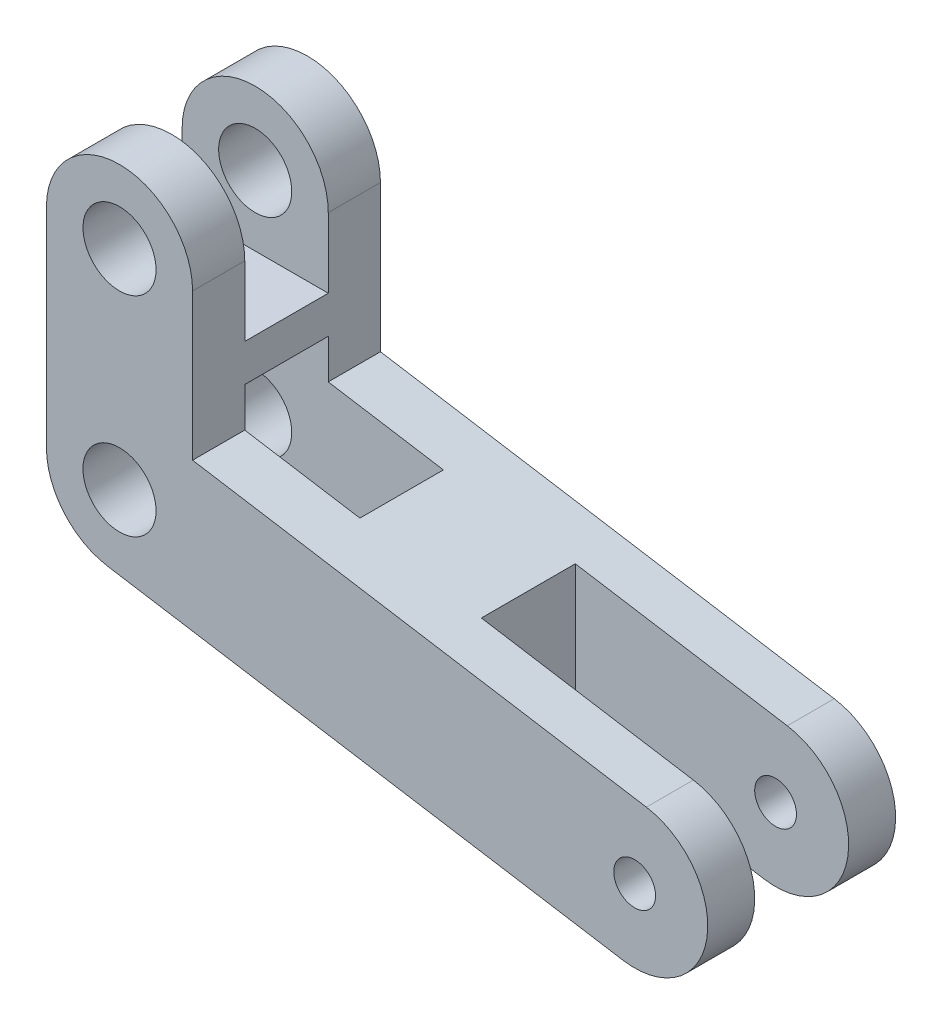
ISO-10303-21;
HEADER;
FILE_DESCRIPTION(('STEP AP214'),'2;1');
FILE_NAME('part.step','',(''),(''),'','','');
FILE_SCHEMA(('AUTOMOTIVE_DESIGN { 1 0 10303 214 1 1 1 1 }'));
ENDSEC;
DATA;
#1=APPLICATION_CONTEXT('core data for automotive mechanical design processes');
#2=APPLICATION_PROTOCOL_DEFINITION('international standard','automotive_design',2000,#1);
#3=PRODUCT_CONTEXT('',#1,'mechanical');
#4=PRODUCT('Part','Part','',(#3));
#5=PRODUCT_RELATED_PRODUCT_CATEGORY('part','',(#4));
#6=PRODUCT_DEFINITION_FORMATION('','',#4);
#7=PRODUCT_DEFINITION_CONTEXT('part definition',#1,'design');
#8=PRODUCT_DEFINITION('design','',#6,#7);
#9=PRODUCT_DEFINITION_SHAPE('','',#8);
#10=(LENGTH_UNIT() NAMED_UNIT(*) SI_UNIT(.MILLI.,.METRE.));
#11=(NAMED_UNIT(*) PLANE_ANGLE_UNIT() SI_UNIT($,.RADIAN.));
#12=(NAMED_UNIT(*) SI_UNIT($,.STERADIAN.) SOLID_ANGLE_UNIT());
#13=UNCERTAINTY_MEASURE_WITH_UNIT(LENGTH_MEASURE(1.E-05),#10,'distance_accuracy_value','');
#14=(GEOMETRIC_REPRESENTATION_CONTEXT(3) GLOBAL_UNCERTAINTY_ASSIGNED_CONTEXT((#13)) GLOBAL_UNIT_ASSIGNED_CONTEXT((#10,
#11,#12)) REPRESENTATION_CONTEXT('',''));
#15=CARTESIAN_POINT('',(0.,0.,0.));
#16=DIRECTION('',(0.,0.,1.));
#17=DIRECTION('',(1.,0.,0.));
#18=AXIS2_PLACEMENT_3D('',#15,#16,#17);
#19=CARTESIAN_POINT('',(24.6779253585061,-4.,4.5));
#20=DIRECTION('',(0.,0.,-1.));
#21=DIRECTION('',(-1.,0.,0.));
#22=AXIS2_PLACEMENT_3D('',#19,#20,#21);
#23=CYLINDRICAL_SURFACE('',#22,3.5);
#24=CARTESIAN_POINT('',(24.6779253585061,-4.,-2.25));
#25=DIRECTION('',(0.,0.,1.));
#26=DIRECTION('',(1.,0.,0.));
#27=AXIS2_PLACEMENT_3D('',#24,#25,#26);
#28=CIRCLE('',#27,3.5);
#29=CARTESIAN_POINT('',(24.1179253585061,-7.45490955019086,-2.25));
#30=VERTEX_POINT('',#29);
#31=CARTESIAN_POINT('',(25.2379253585061,-0.54509044980914,-2.25));
#32=VERTEX_POINT('',#31);
#33=EDGE_CURVE('E219',#30,#32,#28,.T.);
#34=ORIENTED_EDGE('',*,*,#33,.F.);
#35=DIRECTION('',(0.,0.,-1.));
#36=VECTOR('',#35,1.);
#37=CARTESIAN_POINT('',(24.1179253585061,-7.45490955019086,4.5));
#38=LINE('',#37,#36);
#39=CARTESIAN_POINT('',(24.1179253585061,-7.45490955019086,-4.5));
#40=VERTEX_POINT('',#39);
#41=EDGE_CURVE('E323',#30,#40,#38,.T.);
#42=ORIENTED_EDGE('',*,*,#41,.T.);
#43=CARTESIAN_POINT('',(24.6779253585061,-4.,-4.5));
#44=DIRECTION('',(0.,0.,1.));
#45=DIRECTION('',(1.,0.,0.));
#46=AXIS2_PLACEMENT_3D('',#43,#44,#45);
#47=CIRCLE('',#46,3.5);
#48=CARTESIAN_POINT('',(25.2379253585061,-0.54509044980914,-4.5));
#49=VERTEX_POINT('',#48);
#50=EDGE_CURVE('E304',#40,#49,#47,.T.);
#51=ORIENTED_EDGE('',*,*,#50,.T.);
#52=DIRECTION('',(0.,0.,-1.));
#53=VECTOR('',#52,1.);
#54=CARTESIAN_POINT('',(25.2379253585061,-0.54509044980914,4.5));
#55=LINE('',#54,#53);
#56=EDGE_CURVE('E366',#32,#49,#55,.T.);
#57=ORIENTED_EDGE('',*,*,#56,.F.);
#58=EDGE_LOOP('',(#34,#42,#51,#57));
#59=FACE_BOUND('',#58,.T.);
#60=ADVANCED_FACE('F41',(#59),#23,.T.);
#61=CARTESIAN_POINT('',(25.2379253585061,-0.54509044980914,4.5));
#62=DIRECTION('',(-0.16,-0.987117014340245,0.));
#63=DIRECTION('',(0.987117014340245,-0.16,0.));
#64=AXIS2_PLACEMENT_3D('',#61,#62,#63);
#65=PLANE('',#64);
#66=DIRECTION('',(-0.987117014340245,0.16,0.));
#67=VECTOR('',#66,1.);
#68=CARTESIAN_POINT('',(25.2379253585061,-0.54509044980914,-2.25));
#69=LINE('',#68,#67);
#70=CARTESIAN_POINT('',(15.0845161014407,1.10065717436311,-2.25));
#71=VERTEX_POINT('',#70);
#72=EDGE_CURVE('E201',#32,#71,#69,.T.);
#73=ORIENTED_EDGE('',*,*,#72,.F.);
#74=ORIENTED_EDGE('',*,*,#56,.T.);
#75=DIRECTION('',(-0.987117014340245,0.16,0.));
#76=VECTOR('',#75,1.);
#77=CARTESIAN_POINT('',(25.2379253585061,-0.54509044980914,-4.5));
#78=LINE('',#77,#76);
#79=CARTESIAN_POINT('',(3.5,2.97837030188867,-4.5));
#80=VERTEX_POINT('',#79);
#81=EDGE_CURVE('E326',#49,#80,#78,.T.);
#82=ORIENTED_EDGE('',*,*,#81,.T.);
#83=DIRECTION('',(0.,0.,-1.));
#84=VECTOR('',#83,1.);
#85=CARTESIAN_POINT('',(3.5,2.97837030188867,4.5));
#86=LINE('',#85,#84);
#87=CARTESIAN_POINT('',(3.5,2.97837030188867,-2.));
#88=VERTEX_POINT('',#87);
#89=EDGE_CURVE('E362',#88,#80,#86,.T.);
#90=ORIENTED_EDGE('',*,*,#89,.F.);
#91=DIRECTION('',(0.987117014340245,-0.16,0.));
#92=VECTOR('',#91,1.);
#93=CARTESIAN_POINT('',(25.2379253585061,-0.54509044980914,-2.));
#94=LINE('',#93,#92);
#95=CARTESIAN_POINT('',(9.01483292771079,2.08448107131607,-2.));
#96=VERTEX_POINT('',#95);
#97=EDGE_CURVE('E279',#88,#96,#94,.T.);
#98=ORIENTED_EDGE('',*,*,#97,.T.);
#99=DIRECTION('',(0.,0.,1.));
#100=VECTOR('',#99,1.);
#101=CARTESIAN_POINT('',(9.01483292771079,2.08448107131607,4.5));
#102=LINE('',#101,#100);
#103=CARTESIAN_POINT('',(9.01483292771079,2.08448107131607,2.));
#104=VERTEX_POINT('',#103);
#105=EDGE_CURVE('E282',#96,#104,#102,.T.);
#106=ORIENTED_EDGE('',*,*,#105,.T.);
#107=DIRECTION('',(0.987117014340245,-0.16,0.));
#108=VECTOR('',#107,1.);
#109=CARTESIAN_POINT('',(25.2379253585061,-0.54509044980914,2.));
#110=LINE('',#109,#108);
#111=CARTESIAN_POINT('',(3.5,2.97837030188867,2.));
#112=VERTEX_POINT('',#111);
#113=EDGE_CURVE('E264',#112,#104,#110,.T.);
#114=ORIENTED_EDGE('',*,*,#113,.F.);
#115=CARTESIAN_POINT('',(3.5,2.97837030188867,4.5));
#116=VERTEX_POINT('',#115);
#117=EDGE_CURVE('E363',#116,#112,#86,.T.);
#118=ORIENTED_EDGE('',*,*,#117,.F.);
#119=DIRECTION('',(-0.987117014340245,0.16,0.));
#120=VECTOR('',#119,1.);
#121=CARTESIAN_POINT('',(25.2379253585061,-0.54509044980914,4.5));
#122=LINE('',#121,#120);
#123=CARTESIAN_POINT('',(25.2379253585061,-0.54509044980914,4.5));
#124=VERTEX_POINT('',#123);
#125=EDGE_CURVE('E310',#124,#116,#122,.T.);
#126=ORIENTED_EDGE('',*,*,#125,.F.);
#127=CARTESIAN_POINT('',(25.2379253585061,-0.54509044980914,2.25));
#128=VERTEX_POINT('',#127);
#129=EDGE_CURVE('E210',#124,#128,#55,.T.);
#130=ORIENTED_EDGE('',*,*,#129,.T.);
#131=DIRECTION('',(-0.987117014340245,0.16,0.));
#132=VECTOR('',#131,1.);
#133=CARTESIAN_POINT('',(25.2379253585061,-0.54509044980914,2.25));
#134=LINE('',#133,#132);
#135=CARTESIAN_POINT('',(15.0845161014407,1.10065717436311,2.25));
#136=VERTEX_POINT('',#135);
#137=EDGE_CURVE('E204',#128,#136,#134,.T.);
#138=ORIENTED_EDGE('',*,*,#137,.T.);
#139=DIRECTION('',(0.,0.,-1.));
#140=VECTOR('',#139,1.);
#141=CARTESIAN_POINT('',(15.0845161014407,1.10065717436311,4.5));
#142=LINE('',#141,#140);
#143=EDGE_CURVE('E191',#136,#71,#142,.T.);
#144=ORIENTED_EDGE('',*,*,#143,.T.);
#145=EDGE_LOOP('',(#73,#74,#82,#90,#98,#106,#114,#118,#126,#130,#138,#144));
#146=FACE_BOUND('',#145,.T.);
#147=ADVANCED_FACE('F208',(#146),#65,.F.);
#148=CARTESIAN_POINT('',(24.1179253585061,-7.45490955019086,4.5));
#149=DIRECTION('',(0.16,0.987117014340245,0.));
#150=DIRECTION('',(-0.987117014340245,0.16,0.));
#151=AXIS2_PLACEMENT_3D('',#148,#149,#150);
#152=PLANE('',#151);
#153=DIRECTION('',(0.987117014340245,-0.16,0.));
#154=VECTOR('',#153,1.);
#155=CARTESIAN_POINT('',(24.1179253585061,-7.45490955019086,-2.25));
#156=LINE('',#155,#154);
#157=CARTESIAN_POINT('',(15.0845161014407,-5.99070068727658,-2.25));
#158=VERTEX_POINT('',#157);
#159=EDGE_CURVE('E214',#158,#30,#156,.T.);
#160=ORIENTED_EDGE('',*,*,#159,.F.);
#161=DIRECTION('',(0.,0.,1.));
#162=VECTOR('',#161,1.);
#163=CARTESIAN_POINT('',(15.0845161014407,-5.99070068727658,4.5));
#164=LINE('',#163,#162);
#165=CARTESIAN_POINT('',(15.0845161014407,-5.99070068727658,2.25));
#166=VERTEX_POINT('',#165);
#167=EDGE_CURVE('E11',#158,#166,#164,.T.);
#168=ORIENTED_EDGE('',*,*,#167,.T.);
#169=DIRECTION('',(0.987117014340245,-0.16,0.));
#170=VECTOR('',#169,1.);
#171=CARTESIAN_POINT('',(24.1179253585061,-7.45490955019086,2.25));
#172=LINE('',#171,#170);
#173=CARTESIAN_POINT('',(24.1179253585061,-7.45490955019086,2.25));
#174=VERTEX_POINT('',#173);
#175=EDGE_CURVE('E205',#166,#174,#172,.T.);
#176=ORIENTED_EDGE('',*,*,#175,.T.);
#177=CARTESIAN_POINT('',(24.1179253585061,-7.45490955019086,4.5));
#178=VERTEX_POINT('',#177);
#179=EDGE_CURVE('E343',#178,#174,#38,.T.);
#180=ORIENTED_EDGE('',*,*,#179,.F.);
#181=DIRECTION('',(0.987117014340245,-0.16,0.));
#182=VECTOR('',#181,1.);
#183=CARTESIAN_POINT('',(24.1179253585061,-7.45490955019086,4.5));
#184=LINE('',#183,#182);
#185=CARTESIAN_POINT('',(-0.56,-3.45490955019086,4.5));
#186=VERTEX_POINT('',#185);
#187=EDGE_CURVE('E321',#186,#178,#184,.T.);
#188=ORIENTED_EDGE('',*,*,#187,.F.);
#189=DIRECTION('',(0.,0.,-1.));
#190=VECTOR('',#189,1.);
#191=CARTESIAN_POINT('',(-0.56,-3.45490955019086,4.5));
#192=LINE('',#191,#190);
#193=CARTESIAN_POINT('',(-0.560000000000001,-3.45490955019086,2.));
#194=VERTEX_POINT('',#193);
#195=EDGE_CURVE('E347',#186,#194,#192,.T.);
#196=ORIENTED_EDGE('',*,*,#195,.T.);
#197=DIRECTION('',(-0.987117014340245,0.16,0.));
#198=VECTOR('',#197,1.);
#199=CARTESIAN_POINT('',(24.1179253585061,-7.45490955019086,2.));
#200=LINE('',#199,#198);
#201=CARTESIAN_POINT('',(9.01483292771079,-5.00687679032363,2.));
#202=VERTEX_POINT('',#201);
#203=EDGE_CURVE('E256',#202,#194,#200,.T.);
#204=ORIENTED_EDGE('',*,*,#203,.F.);
#205=DIRECTION('',(0.,0.,-1.));
#206=VECTOR('',#205,1.);
#207=CARTESIAN_POINT('',(9.01483292771079,-5.00687679032363,4.5));
#208=LINE('',#207,#206);
#209=CARTESIAN_POINT('',(9.01483292771079,-5.00687679032362,-2.));
#210=VERTEX_POINT('',#209);
#211=EDGE_CURVE('E368',#202,#210,#208,.T.);
#212=ORIENTED_EDGE('',*,*,#211,.T.);
#213=DIRECTION('',(-0.987117014340245,0.16,0.));
#214=VECTOR('',#213,1.);
#215=CARTESIAN_POINT('',(24.1179253585061,-7.45490955019086,-2.));
#216=LINE('',#215,#214);
#217=CARTESIAN_POINT('',(-0.560000000000001,-3.45490955019086,-2.));
#218=VERTEX_POINT('',#217);
#219=EDGE_CURVE('E267',#210,#218,#216,.T.);
#220=ORIENTED_EDGE('',*,*,#219,.T.);
#221=CARTESIAN_POINT('',(-0.56,-3.45490955019086,-4.5));
#222=VERTEX_POINT('',#221);
#223=EDGE_CURVE('E346',#218,#222,#192,.T.);
#224=ORIENTED_EDGE('',*,*,#223,.T.);
#225=DIRECTION('',(0.987117014340245,-0.16,0.));
#226=VECTOR('',#225,1.);
#227=CARTESIAN_POINT('',(24.1179253585061,-7.45490955019086,-4.5));
#228=LINE('',#227,#226);
#229=EDGE_CURVE('E311',#222,#40,#228,.T.);
#230=ORIENTED_EDGE('',*,*,#229,.T.);
#231=ORIENTED_EDGE('',*,*,#41,.F.);
#232=EDGE_LOOP('',(#160,#168,#176,#180,#188,#196,#204,#212,#220,#224,#230,#231));
#233=FACE_BOUND('',#232,.T.);
#234=ADVANCED_FACE('F395',(#233),#152,.F.);
#235=CARTESIAN_POINT('',(24.6779253585061,-4.,4.5));
#236=DIRECTION('',(0.,0.,-1.));
#237=DIRECTION('',(-1.,0.,0.));
#238=AXIS2_PLACEMENT_3D('',#235,#236,#237);
#239=CYLINDRICAL_SURFACE('',#238,0.999999999999998);
#240=CARTESIAN_POINT('',(24.6779253585061,-4.,-4.5));
#241=DIRECTION('',(0.,0.,1.));
#242=DIRECTION('',(1.,0.,0.));
#243=AXIS2_PLACEMENT_3D('',#240,#241,#242);
#244=CIRCLE('',#243,0.999999999999998);
#245=CARTESIAN_POINT('',(25.6779253585061,-4.,-4.5));
#246=VERTEX_POINT('',#245);
#247=EDGE_CURVE('E292',#246,#246,#244,.T.);
#248=ORIENTED_EDGE('',*,*,#247,.F.);
#249=EDGE_LOOP('',(#248));
#250=FACE_BOUND('',#249,.T.);
#251=CARTESIAN_POINT('',(24.6779253585061,-4.,-2.25));
#252=DIRECTION('',(0.,0.,1.));
#253=DIRECTION('',(1.,0.,0.));
#254=AXIS2_PLACEMENT_3D('',#251,#252,#253);
#255=CIRCLE('',#254,0.999999999999998);
#256=CARTESIAN_POINT('',(25.6779253585061,-4.,-2.25));
#257=VERTEX_POINT('',#256);
#258=EDGE_CURVE('E211',#257,#257,#255,.T.);
#259=ORIENTED_EDGE('',*,*,#258,.T.);
#260=EDGE_LOOP('',(#259));
#261=FACE_BOUND('',#260,.T.);
#262=ADVANCED_FACE('F470',(#250,#261),#239,.F.);
#263=CARTESIAN_POINT('',(3.5,10.,4.5));
#264=DIRECTION('',(-1.,0.,0.));
#265=DIRECTION('',(0.,-1.,0.));
#266=AXIS2_PLACEMENT_3D('',#263,#264,#265);
#267=PLANE('',#266);
#268=DIRECTION('',(0.,1.,0.));
#269=VECTOR('',#268,1.);
#270=CARTESIAN_POINT('',(3.5,16.4698635435501,-2.));
#271=LINE('',#270,#269);
#272=CARTESIAN_POINT('',(3.5,6.65669603838257,-2.));
#273=VERTEX_POINT('',#272);
#274=CARTESIAN_POINT('',(3.5,10.,-2.));
#275=VERTEX_POINT('',#274);
#276=EDGE_CURVE('E224',#273,#275,#271,.T.);
#277=ORIENTED_EDGE('',*,*,#276,.F.);
#278=DIRECTION('',(0.,0.,1.));
#279=VECTOR('',#278,1.);
#280=CARTESIAN_POINT('',(3.5,6.65669603838257,-2.));
#281=LINE('',#280,#279);
#282=CARTESIAN_POINT('',(3.5,6.65669603838257,2.));
#283=VERTEX_POINT('',#282);
#284=EDGE_CURVE('E227',#273,#283,#281,.T.);
#285=ORIENTED_EDGE('',*,*,#284,.T.);
#286=DIRECTION('',(0.,1.,0.));
#287=VECTOR('',#286,1.);
#288=CARTESIAN_POINT('',(3.5,16.4698635435501,2.));
#289=LINE('',#288,#287);
#290=CARTESIAN_POINT('',(3.5,10.,2.));
#291=VERTEX_POINT('',#290);
#292=EDGE_CURVE('E225',#283,#291,#289,.T.);
#293=ORIENTED_EDGE('',*,*,#292,.T.);
#294=DIRECTION('',(0.,0.,-1.));
#295=VECTOR('',#294,1.);
#296=CARTESIAN_POINT('',(3.5,10.,4.5));
#297=LINE('',#296,#295);
#298=CARTESIAN_POINT('',(3.5,10.,4.5));
#299=VERTEX_POINT('',#298);
#300=EDGE_CURVE('E359',#299,#291,#297,.T.);
#301=ORIENTED_EDGE('',*,*,#300,.F.);
#302=DIRECTION('',(0.,1.,0.));
#303=VECTOR('',#302,1.);
#304=CARTESIAN_POINT('',(3.5,10.,4.5));
#305=LINE('',#304,#303);
#306=EDGE_CURVE('E313',#116,#299,#305,.T.);
#307=ORIENTED_EDGE('',*,*,#306,.F.);
#308=ORIENTED_EDGE('',*,*,#117,.T.);
#309=DIRECTION('',(0.,-1.,0.));
#310=VECTOR('',#309,1.);
#311=CARTESIAN_POINT('',(3.5,10.,2.));
#312=LINE('',#311,#310);
#313=CARTESIAN_POINT('',(3.5,4.86934920884361,2.));
#314=VERTEX_POINT('',#313);
#315=EDGE_CURVE('E262',#314,#112,#312,.T.);
#316=ORIENTED_EDGE('',*,*,#315,.F.);
#317=DIRECTION('',(0.,0.,-1.));
#318=VECTOR('',#317,1.);
#319=CARTESIAN_POINT('',(3.5,4.86934920884361,4.5));
#320=LINE('',#319,#318);
#321=CARTESIAN_POINT('',(3.5,4.86934920884361,-2.));
#322=VERTEX_POINT('',#321);
#323=EDGE_CURVE('E285',#314,#322,#320,.T.);
#324=ORIENTED_EDGE('',*,*,#323,.T.);
#325=DIRECTION('',(0.,-1.,0.));
#326=VECTOR('',#325,1.);
#327=CARTESIAN_POINT('',(3.5,10.,-2.));
#328=LINE('',#327,#326);
#329=EDGE_CURVE('E276',#322,#88,#328,.T.);
#330=ORIENTED_EDGE('',*,*,#329,.T.);
#331=ORIENTED_EDGE('',*,*,#89,.T.);
#332=DIRECTION('',(0.,1.,0.));
#333=VECTOR('',#332,1.);
#334=CARTESIAN_POINT('',(3.5,10.,-4.5));
#335=LINE('',#334,#333);
#336=CARTESIAN_POINT('',(3.5,10.,-4.5));
#337=VERTEX_POINT('',#336);
#338=EDGE_CURVE('E329',#80,#337,#335,.T.);
#339=ORIENTED_EDGE('',*,*,#338,.T.);
#340=EDGE_CURVE('E358',#275,#337,#297,.T.);
#341=ORIENTED_EDGE('',*,*,#340,.F.);
#342=EDGE_LOOP('',(#277,#285,#293,#301,#307,#308,#316,#324,#330,#331,#339,#341));
#343=FACE_BOUND('',#342,.T.);
#344=ADVANCED_FACE('F411',(#343),#267,.F.);
#345=CARTESIAN_POINT('',(0.,10.,4.5));
#346=DIRECTION('',(0.,0.,-1.));
#347=DIRECTION('',(-1.,0.,0.));
#348=AXIS2_PLACEMENT_3D('',#345,#346,#347);
#349=CYLINDRICAL_SURFACE('',#348,3.5);
#350=CARTESIAN_POINT('',(0.,10.,-2.));
#351=DIRECTION('',(0.,0.,1.));
#352=DIRECTION('',(1.,0.,0.));
#353=AXIS2_PLACEMENT_3D('',#350,#351,#352);
#354=CIRCLE('',#353,3.5);
#355=CARTESIAN_POINT('',(-3.5,10.,-2.));
#356=VERTEX_POINT('',#355);
#357=EDGE_CURVE('E253',#275,#356,#354,.T.);
#358=ORIENTED_EDGE('',*,*,#357,.F.);
#359=ORIENTED_EDGE('',*,*,#340,.T.);
#360=CARTESIAN_POINT('',(0.,10.,-4.5));
#361=DIRECTION('',(0.,0.,1.));
#362=DIRECTION('',(1.,0.,0.));
#363=AXIS2_PLACEMENT_3D('',#360,#361,#362);
#364=CIRCLE('',#363,3.5);
#365=CARTESIAN_POINT('',(-3.5,10.,-4.5));
#366=VERTEX_POINT('',#365);
#367=EDGE_CURVE('E332',#337,#366,#364,.T.);
#368=ORIENTED_EDGE('',*,*,#367,.T.);
#369=DIRECTION('',(0.,0.,-1.));
#370=VECTOR('',#369,1.);
#371=CARTESIAN_POINT('',(-3.5,10.,4.5));
#372=LINE('',#371,#370);
#373=EDGE_CURVE('E354',#356,#366,#372,.T.);
#374=ORIENTED_EDGE('',*,*,#373,.F.);
#375=EDGE_LOOP('',(#358,#359,#368,#374));
#376=FACE_BOUND('',#375,.T.);
#377=ADVANCED_FACE('F459',(#376),#349,.T.);
#378=CARTESIAN_POINT('',(-3.5,10.,4.5));
#379=DIRECTION('',(1.,0.,0.));
#380=DIRECTION('',(0.,1.,0.));
#381=AXIS2_PLACEMENT_3D('',#378,#379,#380);
#382=PLANE('',#381);
#383=DIRECTION('',(0.,-1.,0.));
#384=VECTOR('',#383,1.);
#385=CARTESIAN_POINT('',(-3.5,10.,-2.));
#386=LINE('',#385,#384);
#387=CARTESIAN_POINT('',(-3.5,6.65669603838257,-2.));
#388=VERTEX_POINT('',#387);
#389=EDGE_CURVE('E251',#356,#388,#386,.T.);
#390=ORIENTED_EDGE('',*,*,#389,.F.);
#391=ORIENTED_EDGE('',*,*,#373,.T.);
#392=DIRECTION('',(0.,-1.,0.));
#393=VECTOR('',#392,1.);
#394=CARTESIAN_POINT('',(-3.5,10.,-4.5));
#395=LINE('',#394,#393);
#396=CARTESIAN_POINT('',(-3.5,0.,-4.5));
#397=VERTEX_POINT('',#396);
#398=EDGE_CURVE('E335',#366,#397,#395,.T.);
#399=ORIENTED_EDGE('',*,*,#398,.T.);
#400=DIRECTION('',(0.,0.,-1.));
#401=VECTOR('',#400,1.);
#402=CARTESIAN_POINT('',(-3.5,0.,4.5));
#403=LINE('',#402,#401);
#404=CARTESIAN_POINT('',(-3.5,0.,-2.));
#405=VERTEX_POINT('',#404);
#406=EDGE_CURVE('E350',#405,#397,#403,.T.);
#407=ORIENTED_EDGE('',*,*,#406,.F.);
#408=DIRECTION('',(0.,1.,0.));
#409=VECTOR('',#408,1.);
#410=CARTESIAN_POINT('',(-3.5,10.,-2.));
#411=LINE('',#410,#409);
#412=CARTESIAN_POINT('',(-3.5,4.86934920884361,-2.));
#413=VERTEX_POINT('',#412);
#414=EDGE_CURVE('E273',#405,#413,#411,.T.);
#415=ORIENTED_EDGE('',*,*,#414,.T.);
#416=DIRECTION('',(0.,0.,1.));
#417=VECTOR('',#416,1.);
#418=CARTESIAN_POINT('',(-3.5,4.86934920884361,4.5));
#419=LINE('',#418,#417);
#420=CARTESIAN_POINT('',(-3.5,4.86934920884361,2.));
#421=VERTEX_POINT('',#420);
#422=EDGE_CURVE('E379',#413,#421,#419,.T.);
#423=ORIENTED_EDGE('',*,*,#422,.T.);
#424=DIRECTION('',(0.,1.,0.));
#425=VECTOR('',#424,1.);
#426=CARTESIAN_POINT('',(-3.5,10.,2.));
#427=LINE('',#426,#425);
#428=CARTESIAN_POINT('',(-3.5,0.,2.));
#429=VERTEX_POINT('',#428);
#430=EDGE_CURVE('E260',#429,#421,#427,.T.);
#431=ORIENTED_EDGE('',*,*,#430,.F.);
#432=CARTESIAN_POINT('',(-3.5,0.,4.5));
#433=VERTEX_POINT('',#432);
#434=EDGE_CURVE('E351',#433,#429,#403,.T.);
#435=ORIENTED_EDGE('',*,*,#434,.F.);
#436=DIRECTION('',(0.,-1.,0.));
#437=VECTOR('',#436,1.);
#438=CARTESIAN_POINT('',(-3.5,10.,4.5));
#439=LINE('',#438,#437);
#440=CARTESIAN_POINT('',(-3.5,10.,4.5));
#441=VERTEX_POINT('',#440);
#442=EDGE_CURVE('E317',#441,#433,#439,.T.);
#443=ORIENTED_EDGE('',*,*,#442,.F.);
#444=CARTESIAN_POINT('',(-3.5,10.,2.));
#445=VERTEX_POINT('',#444);
#446=EDGE_CURVE('E355',#441,#445,#372,.T.);
#447=ORIENTED_EDGE('',*,*,#446,.T.);
#448=DIRECTION('',(0.,-1.,0.));
#449=VECTOR('',#448,1.);
#450=CARTESIAN_POINT('',(-3.5,10.,2.));
#451=LINE('',#450,#449);
#452=CARTESIAN_POINT('',(-3.5,6.65669603838257,2.));
#453=VERTEX_POINT('',#452);
#454=EDGE_CURVE('E244',#445,#453,#451,.T.);
#455=ORIENTED_EDGE('',*,*,#454,.T.);
#456=DIRECTION('',(0.,0.,-1.));
#457=VECTOR('',#456,1.);
#458=CARTESIAN_POINT('',(-3.5,6.65669603838257,4.5));
#459=LINE('',#458,#457);
#460=EDGE_CURVE('E49',#453,#388,#459,.T.);
#461=ORIENTED_EDGE('',*,*,#460,.T.);
#462=EDGE_LOOP('',(#390,#391,#399,#407,#415,#423,#431,#435,#443,#447,#455,#461));
#463=FACE_BOUND('',#462,.T.);
#464=ADVANCED_FACE('F434',(#463),#382,.F.);
#465=CARTESIAN_POINT('',(0.,0.,4.5));
#466=DIRECTION('',(0.,0.,-1.));
#467=DIRECTION('',(-1.,0.,0.));
#468=AXIS2_PLACEMENT_3D('',#465,#466,#467);
#469=CYLINDRICAL_SURFACE('',#468,3.5);
#470=CARTESIAN_POINT('',(0.,0.,2.));
#471=DIRECTION('',(0.,0.,-1.));
#472=DIRECTION('',(-1.,0.,0.));
#473=AXIS2_PLACEMENT_3D('',#470,#471,#472);
#474=CIRCLE('',#473,3.5);
#475=EDGE_CURVE('E258',#194,#429,#474,.T.);
#476=ORIENTED_EDGE('',*,*,#475,.F.);
#477=ORIENTED_EDGE('',*,*,#195,.F.);
#478=CARTESIAN_POINT('',(0.,0.,4.5));
#479=DIRECTION('',(0.,0.,1.));
#480=DIRECTION('',(1.,0.,0.));
#481=AXIS2_PLACEMENT_3D('',#478,#479,#480);
#482=CIRCLE('',#481,3.5);
#483=EDGE_CURVE('E319',#433,#186,#482,.T.);
#484=ORIENTED_EDGE('',*,*,#483,.F.);
#485=ORIENTED_EDGE('',*,*,#434,.T.);
#486=EDGE_LOOP('',(#476,#477,#484,#485));
#487=FACE_BOUND('',#486,.T.);
#488=ADVANCED_FACE('F428',(#487),#469,.T.);
#489=CARTESIAN_POINT('',(0.,0.,4.5));
#490=DIRECTION('',(0.,0.,-1.));
#491=DIRECTION('',(-1.,0.,0.));
#492=AXIS2_PLACEMENT_3D('',#489,#490,#491);
#493=CYLINDRICAL_SURFACE('',#492,1.75);
#494=CARTESIAN_POINT('',(0.,0.,4.5));
#495=DIRECTION('',(0.,0.,1.));
#496=DIRECTION('',(1.,0.,0.));
#497=AXIS2_PLACEMENT_3D('',#494,#495,#496);
#498=CIRCLE('',#497,1.75);
#499=CARTESIAN_POINT('',(1.75,0.,4.5));
#500=VERTEX_POINT('',#499);
#501=EDGE_CURVE('E301',#500,#500,#498,.T.);
#502=ORIENTED_EDGE('',*,*,#501,.T.);
#503=EDGE_LOOP('',(#502));
#504=FACE_BOUND('',#503,.T.);
#505=CARTESIAN_POINT('',(0.,0.,2.));
#506=DIRECTION('',(0.,0.,-1.));
#507=DIRECTION('',(-1.,0.,0.));
#508=AXIS2_PLACEMENT_3D('',#505,#506,#507);
#509=CIRCLE('',#508,1.75);
#510=CARTESIAN_POINT('',(-1.75,0.,2.));
#511=VERTEX_POINT('',#510);
#512=EDGE_CURVE('E255',#511,#511,#509,.T.);
#513=ORIENTED_EDGE('',*,*,#512,.T.);
#514=EDGE_LOOP('',(#513));
#515=FACE_BOUND('',#514,.T.);
#516=ADVANCED_FACE('F489',(#504,#515),#493,.F.);
#517=CARTESIAN_POINT('',(0.,10.,4.5));
#518=DIRECTION('',(0.,0.,-1.));
#519=DIRECTION('',(-1.,0.,0.));
#520=AXIS2_PLACEMENT_3D('',#517,#518,#519);
#521=CYLINDRICAL_SURFACE('',#520,1.75);
#522=CARTESIAN_POINT('',(0.,10.,-4.5));
#523=DIRECTION('',(0.,0.,1.));
#524=DIRECTION('',(1.,0.,0.));
#525=AXIS2_PLACEMENT_3D('',#522,#523,#524);
#526=CIRCLE('',#525,1.75);
#527=CARTESIAN_POINT('',(1.75,10.,-4.5));
#528=VERTEX_POINT('',#527);
#529=EDGE_CURVE('E288',#528,#528,#526,.T.);
#530=ORIENTED_EDGE('',*,*,#529,.F.);
#531=EDGE_LOOP('',(#530));
#532=FACE_BOUND('',#531,.T.);
#533=CARTESIAN_POINT('',(0.,10.,-2.));
#534=DIRECTION('',(0.,0.,1.));
#535=DIRECTION('',(1.,0.,0.));
#536=AXIS2_PLACEMENT_3D('',#533,#534,#535);
#537=CIRCLE('',#536,1.75);
#538=CARTESIAN_POINT('',(1.75,10.,-2.));
#539=VERTEX_POINT('',#538);
#540=EDGE_CURVE('E250',#539,#539,#537,.T.);
#541=ORIENTED_EDGE('',*,*,#540,.T.);
#542=EDGE_LOOP('',(#541));
#543=FACE_BOUND('',#542,.T.);
#544=ADVANCED_FACE('F483',(#532,#543),#521,.F.);
#545=CARTESIAN_POINT('',(24.6779253585061,-4.,4.5));
#546=DIRECTION('',(0.,0.,1.));
#547=DIRECTION('',(1.,0.,0.));
#548=AXIS2_PLACEMENT_3D('',#545,#546,#547);
#549=PLANE('',#548);
#550=CARTESIAN_POINT('',(24.6779253585061,-4.,4.5));
#551=DIRECTION('',(0.,0.,1.));
#552=DIRECTION('',(1.,0.,0.));
#553=AXIS2_PLACEMENT_3D('',#550,#551,#552);
#554=CIRCLE('',#553,0.999999999999998);
#555=CARTESIAN_POINT('',(25.6779253585061,-4.,4.5));
#556=VERTEX_POINT('',#555);
#557=EDGE_CURVE('E295',#556,#556,#554,.T.);
#558=ORIENTED_EDGE('',*,*,#557,.F.);
#559=EDGE_LOOP('',(#558));
#560=FACE_BOUND('',#559,.T.);
#561=CARTESIAN_POINT('',(24.6779253585061,-4.,4.5));
#562=DIRECTION('',(0.,0.,1.));
#563=DIRECTION('',(1.,0.,0.));
#564=AXIS2_PLACEMENT_3D('',#561,#562,#563);
#565=CIRCLE('',#564,3.5);
#566=EDGE_CURVE('E307',#178,#124,#565,.T.);
#567=ORIENTED_EDGE('',*,*,#566,.T.);
#568=ORIENTED_EDGE('',*,*,#125,.T.);
#569=ORIENTED_EDGE('',*,*,#306,.T.);
#570=CARTESIAN_POINT('',(0.,10.,4.5));
#571=DIRECTION('',(0.,0.,1.));
#572=DIRECTION('',(1.,0.,0.));
#573=AXIS2_PLACEMENT_3D('',#570,#571,#572);
#574=CIRCLE('',#573,3.5);
#575=EDGE_CURVE('E315',#299,#441,#574,.T.);
#576=ORIENTED_EDGE('',*,*,#575,.T.);
#577=ORIENTED_EDGE('',*,*,#442,.T.);
#578=ORIENTED_EDGE('',*,*,#483,.T.);
#579=ORIENTED_EDGE('',*,*,#187,.T.);
#580=EDGE_LOOP('',(#567,#568,#569,#576,#577,#578,#579));
#581=FACE_BOUND('',#580,.T.);
#582=ORIENTED_EDGE('',*,*,#501,.F.);
#583=EDGE_LOOP('',(#582));
#584=FACE_BOUND('',#583,.T.);
#585=CARTESIAN_POINT('',(0.,10.,4.5));
#586=DIRECTION('',(0.,0.,1.));
#587=DIRECTION('',(1.,0.,0.));
#588=AXIS2_PLACEMENT_3D('',#585,#586,#587);
#589=CIRCLE('',#588,1.75);
#590=CARTESIAN_POINT('',(1.75,10.,4.5));
#591=VERTEX_POINT('',#590);
#592=EDGE_CURVE('E289',#591,#591,#589,.T.);
#593=ORIENTED_EDGE('',*,*,#592,.F.);
#594=EDGE_LOOP('',(#593));
#595=FACE_BOUND('',#594,.T.);
#596=ADVANCED_FACE('F443',(#560,#581,#584,#595),#549,.T.);
#597=CARTESIAN_POINT('',(24.6779253585061,-4.,-4.5));
#598=DIRECTION('',(0.,0.,1.));
#599=DIRECTION('',(1.,0.,0.));
#600=AXIS2_PLACEMENT_3D('',#597,#598,#599);
#601=PLANE('',#600);
#602=ORIENTED_EDGE('',*,*,#50,.F.);
#603=ORIENTED_EDGE('',*,*,#229,.F.);
#604=CARTESIAN_POINT('',(0.,0.,-4.5));
#605=DIRECTION('',(0.,0.,1.));
#606=DIRECTION('',(1.,0.,0.));
#607=AXIS2_PLACEMENT_3D('',#604,#605,#606);
#608=CIRCLE('',#607,3.5);
#609=EDGE_CURVE('E338',#397,#222,#608,.T.);
#610=ORIENTED_EDGE('',*,*,#609,.F.);
#611=ORIENTED_EDGE('',*,*,#398,.F.);
#612=ORIENTED_EDGE('',*,*,#367,.F.);
#613=ORIENTED_EDGE('',*,*,#338,.F.);
#614=ORIENTED_EDGE('',*,*,#81,.F.);
#615=EDGE_LOOP('',(#602,#603,#610,#611,#612,#613,#614));
#616=FACE_BOUND('',#615,.T.);
#617=CARTESIAN_POINT('',(0.,0.,-4.5));
#618=DIRECTION('',(0.,0.,1.));
#619=DIRECTION('',(1.,0.,0.));
#620=AXIS2_PLACEMENT_3D('',#617,#618,#619);
#621=CIRCLE('',#620,1.75);
#622=CARTESIAN_POINT('',(1.75,0.,-4.5));
#623=VERTEX_POINT('',#622);
#624=EDGE_CURVE('E298',#623,#623,#621,.T.);
#625=ORIENTED_EDGE('',*,*,#624,.T.);
#626=EDGE_LOOP('',(#625));
#627=FACE_BOUND('',#626,.T.);
#628=ORIENTED_EDGE('',*,*,#247,.T.);
#629=EDGE_LOOP('',(#628));
#630=FACE_BOUND('',#629,.T.);
#631=ORIENTED_EDGE('',*,*,#529,.T.);
#632=EDGE_LOOP('',(#631));
#633=FACE_BOUND('',#632,.T.);
#634=ADVANCED_FACE('F404',(#616,#627,#630,#633),#601,.F.);
#635=ORIENTED_EDGE('',*,*,#179,.T.);
#636=CARTESIAN_POINT('',(24.6779253585061,-4.,2.25));
#637=DIRECTION('',(0.,0.,1.));
#638=DIRECTION('',(1.,0.,0.));
#639=AXIS2_PLACEMENT_3D('',#636,#637,#638);
#640=CIRCLE('',#639,3.5);
#641=EDGE_CURVE('E56',#174,#128,#640,.T.);
#642=ORIENTED_EDGE('',*,*,#641,.T.);
#643=ORIENTED_EDGE('',*,*,#129,.F.);
#644=ORIENTED_EDGE('',*,*,#566,.F.);
#645=EDGE_LOOP('',(#635,#642,#643,#644));
#646=FACE_BOUND('',#645,.T.);
#647=ADVANCED_FACE('F43',(#646),#23,.T.);
#648=ORIENTED_EDGE('',*,*,#300,.T.);
#649=CARTESIAN_POINT('',(0.,10.,2.));
#650=DIRECTION('',(0.,0.,1.));
#651=DIRECTION('',(1.,0.,0.));
#652=AXIS2_PLACEMENT_3D('',#649,#650,#651);
#653=CIRCLE('',#652,3.5);
#654=EDGE_CURVE('E247',#291,#445,#653,.T.);
#655=ORIENTED_EDGE('',*,*,#654,.T.);
#656=ORIENTED_EDGE('',*,*,#446,.F.);
#657=ORIENTED_EDGE('',*,*,#575,.F.);
#658=EDGE_LOOP('',(#648,#655,#656,#657));
#659=FACE_BOUND('',#658,.T.);
#660=ADVANCED_FACE('F450',(#659),#349,.T.);
#661=ORIENTED_EDGE('',*,*,#223,.F.);
#662=CARTESIAN_POINT('',(0.,0.,-2.));
#663=DIRECTION('',(0.,0.,-1.));
#664=DIRECTION('',(-1.,0.,0.));
#665=AXIS2_PLACEMENT_3D('',#662,#663,#664);
#666=CIRCLE('',#665,3.5);
#667=EDGE_CURVE('E270',#218,#405,#666,.T.);
#668=ORIENTED_EDGE('',*,*,#667,.T.);
#669=ORIENTED_EDGE('',*,*,#406,.T.);
#670=ORIENTED_EDGE('',*,*,#609,.T.);
#671=EDGE_LOOP('',(#661,#668,#669,#670));
#672=FACE_BOUND('',#671,.T.);
#673=ADVANCED_FACE('F456',(#672),#469,.T.);
#674=CARTESIAN_POINT('',(0.,0.,-2.));
#675=DIRECTION('',(0.,0.,-1.));
#676=DIRECTION('',(-1.,0.,0.));
#677=AXIS2_PLACEMENT_3D('',#674,#675,#676);
#678=CIRCLE('',#677,1.75);
#679=CARTESIAN_POINT('',(-1.75,0.,-2.));
#680=VERTEX_POINT('',#679);
#681=EDGE_CURVE('E266',#680,#680,#678,.T.);
#682=ORIENTED_EDGE('',*,*,#681,.F.);
#683=EDGE_LOOP('',(#682));
#684=FACE_BOUND('',#683,.T.);
#685=ORIENTED_EDGE('',*,*,#624,.F.);
#686=EDGE_LOOP('',(#685));
#687=FACE_BOUND('',#686,.T.);
#688=ADVANCED_FACE('F478',(#684,#687),#493,.F.);
#689=CARTESIAN_POINT('',(24.6779253585061,-4.,2.25));
#690=DIRECTION('',(0.,0.,1.));
#691=DIRECTION('',(1.,0.,0.));
#692=AXIS2_PLACEMENT_3D('',#689,#690,#691);
#693=CIRCLE('',#692,0.999999999999998);
#694=CARTESIAN_POINT('',(25.6779253585061,-4.,2.25));
#695=VERTEX_POINT('',#694);
#696=EDGE_CURVE('E384',#695,#695,#693,.T.);
#697=ORIENTED_EDGE('',*,*,#696,.F.);
#698=EDGE_LOOP('',(#697));
#699=FACE_BOUND('',#698,.T.);
#700=ORIENTED_EDGE('',*,*,#557,.T.);
#701=EDGE_LOOP('',(#700));
#702=FACE_BOUND('',#701,.T.);
#703=ADVANCED_FACE('F487',(#699,#702),#239,.F.);
#704=CARTESIAN_POINT('',(0.,10.,2.));
#705=DIRECTION('',(0.,0.,1.));
#706=DIRECTION('',(1.,0.,0.));
#707=AXIS2_PLACEMENT_3D('',#704,#705,#706);
#708=CIRCLE('',#707,1.75);
#709=CARTESIAN_POINT('',(1.75,10.,2.));
#710=VERTEX_POINT('',#709);
#711=EDGE_CURVE('E235',#710,#710,#708,.T.);
#712=ORIENTED_EDGE('',*,*,#711,.F.);
#713=EDGE_LOOP('',(#712));
#714=FACE_BOUND('',#713,.T.);
#715=ORIENTED_EDGE('',*,*,#592,.T.);
#716=EDGE_LOOP('',(#715));
#717=FACE_BOUND('',#716,.T.);
#718=ADVANCED_FACE('F491',(#714,#717),#521,.F.);
#719=CARTESIAN_POINT('',(-5.69968246198156,6.65669603838257,-2.));
#720=DIRECTION('',(0.,-1.,0.));
#721=DIRECTION('',(0.,0.,-1.));
#722=AXIS2_PLACEMENT_3D('',#719,#720,#721);
#723=PLANE('',#722);
#724=DIRECTION('',(1.,0.,0.));
#725=VECTOR('',#724,1.);
#726=CARTESIAN_POINT('',(-5.69968246198156,6.65669603838257,2.));
#727=LINE('',#726,#725);
#728=EDGE_CURVE('E228',#453,#283,#727,.T.);
#729=ORIENTED_EDGE('',*,*,#728,.T.);
#730=ORIENTED_EDGE('',*,*,#284,.F.);
#731=DIRECTION('',(1.,0.,0.));
#732=VECTOR('',#731,1.);
#733=CARTESIAN_POINT('',(-5.69968246198156,6.65669603838257,-2.));
#734=LINE('',#733,#732);
#735=EDGE_CURVE('E222',#388,#273,#734,.T.);
#736=ORIENTED_EDGE('',*,*,#735,.F.);
#737=ORIENTED_EDGE('',*,*,#460,.F.);
#738=EDGE_LOOP('',(#729,#730,#736,#737));
#739=FACE_BOUND('',#738,.T.);
#740=ADVANCED_FACE('F495',(#739),#723,.F.);
#741=CARTESIAN_POINT('',(0.,0.,-2.));
#742=DIRECTION('',(0.,0.,1.));
#743=DIRECTION('',(1.,0.,0.));
#744=AXIS2_PLACEMENT_3D('',#741,#742,#743);
#745=PLANE('',#744);
#746=ORIENTED_EDGE('',*,*,#540,.F.);
#747=EDGE_LOOP('',(#746));
#748=FACE_BOUND('',#747,.T.);
#749=ORIENTED_EDGE('',*,*,#357,.T.);
#750=ORIENTED_EDGE('',*,*,#389,.T.);
#751=ORIENTED_EDGE('',*,*,#735,.T.);
#752=ORIENTED_EDGE('',*,*,#276,.T.);
#753=EDGE_LOOP('',(#749,#750,#751,#752));
#754=FACE_BOUND('',#753,.T.);
#755=ADVANCED_FACE('F509',(#748,#754),#745,.T.);
#756=CARTESIAN_POINT('',(0.,0.,2.));
#757=DIRECTION('',(0.,0.,1.));
#758=DIRECTION('',(1.,0.,0.));
#759=AXIS2_PLACEMENT_3D('',#756,#757,#758);
#760=PLANE('',#759);
#761=ORIENTED_EDGE('',*,*,#711,.T.);
#762=EDGE_LOOP('',(#761));
#763=FACE_BOUND('',#762,.T.);
#764=ORIENTED_EDGE('',*,*,#292,.F.);
#765=ORIENTED_EDGE('',*,*,#728,.F.);
#766=ORIENTED_EDGE('',*,*,#454,.F.);
#767=ORIENTED_EDGE('',*,*,#654,.F.);
#768=EDGE_LOOP('',(#764,#765,#766,#767));
#769=FACE_BOUND('',#768,.T.);
#770=ADVANCED_FACE('F501',(#763,#769),#760,.F.);
#771=CARTESIAN_POINT('',(-5.64552182951993,4.86934920884361,-2.));
#772=DIRECTION('',(0.,1.,0.));
#773=DIRECTION('',(0.,0.,1.));
#774=AXIS2_PLACEMENT_3D('',#771,#772,#773);
#775=PLANE('',#774);
#776=DIRECTION('',(-1.,0.,0.));
#777=VECTOR('',#776,1.);
#778=CARTESIAN_POINT('',(-5.64552182951993,4.86934920884361,2.));
#779=LINE('',#778,#777);
#780=EDGE_CURVE('E64',#314,#421,#779,.T.);
#781=ORIENTED_EDGE('',*,*,#780,.T.);
#782=ORIENTED_EDGE('',*,*,#422,.F.);
#783=DIRECTION('',(-1.,0.,0.));
#784=VECTOR('',#783,1.);
#785=CARTESIAN_POINT('',(-5.64552182951993,4.86934920884361,-2.));
#786=LINE('',#785,#784);
#787=EDGE_CURVE('E230',#322,#413,#786,.T.);
#788=ORIENTED_EDGE('',*,*,#787,.F.);
#789=ORIENTED_EDGE('',*,*,#323,.F.);
#790=EDGE_LOOP('',(#781,#782,#788,#789));
#791=FACE_BOUND('',#790,.T.);
#792=ADVANCED_FACE('F436',(#791),#775,.F.);
#793=CARTESIAN_POINT('',(9.01483292771079,-5.65610443682518,-2.));
#794=DIRECTION('',(1.,0.,0.));
#795=DIRECTION('',(0.,0.,-1.));
#796=AXIS2_PLACEMENT_3D('',#793,#794,#795);
#797=PLANE('',#796);
#798=DIRECTION('',(0.,1.,0.));
#799=VECTOR('',#798,1.);
#800=CARTESIAN_POINT('',(9.01483292771079,-5.65610443682518,-2.));
#801=LINE('',#800,#799);
#802=EDGE_CURVE('E236',#210,#96,#801,.T.);
#803=ORIENTED_EDGE('',*,*,#802,.F.);
#804=ORIENTED_EDGE('',*,*,#211,.F.);
#805=DIRECTION('',(0.,1.,0.));
#806=VECTOR('',#805,1.);
#807=CARTESIAN_POINT('',(9.01483292771079,-5.65610443682518,2.));
#808=LINE('',#807,#806);
#809=EDGE_CURVE('E200',#202,#104,#808,.T.);
#810=ORIENTED_EDGE('',*,*,#809,.T.);
#811=ORIENTED_EDGE('',*,*,#105,.F.);
#812=EDGE_LOOP('',(#803,#804,#810,#811));
#813=FACE_BOUND('',#812,.T.);
#814=ADVANCED_FACE('F419',(#813),#797,.F.);
#815=CARTESIAN_POINT('',(0.,0.,-2.));
#816=DIRECTION('',(0.,0.,-1.));
#817=DIRECTION('',(-1.,0.,0.));
#818=AXIS2_PLACEMENT_3D('',#815,#816,#817);
#819=PLANE('',#818);
#820=ORIENTED_EDGE('',*,*,#681,.T.);
#821=EDGE_LOOP('',(#820));
#822=FACE_BOUND('',#821,.T.);
#823=ORIENTED_EDGE('',*,*,#329,.F.);
#824=ORIENTED_EDGE('',*,*,#787,.T.);
#825=ORIENTED_EDGE('',*,*,#414,.F.);
#826=ORIENTED_EDGE('',*,*,#667,.F.);
#827=ORIENTED_EDGE('',*,*,#219,.F.);
#828=ORIENTED_EDGE('',*,*,#802,.T.);
#829=ORIENTED_EDGE('',*,*,#97,.F.);
#830=EDGE_LOOP('',(#823,#824,#825,#826,#827,#828,#829));
#831=FACE_BOUND('',#830,.T.);
#832=ADVANCED_FACE('F414',(#822,#831),#819,.F.);
#833=CARTESIAN_POINT('',(0.,0.,2.));
#834=DIRECTION('',(0.,0.,-1.));
#835=DIRECTION('',(-1.,0.,0.));
#836=AXIS2_PLACEMENT_3D('',#833,#834,#835);
#837=PLANE('',#836);
#838=ORIENTED_EDGE('',*,*,#512,.F.);
#839=EDGE_LOOP('',(#838));
#840=FACE_BOUND('',#839,.T.);
#841=ORIENTED_EDGE('',*,*,#113,.T.);
#842=ORIENTED_EDGE('',*,*,#809,.F.);
#843=ORIENTED_EDGE('',*,*,#203,.T.);
#844=ORIENTED_EDGE('',*,*,#475,.T.);
#845=ORIENTED_EDGE('',*,*,#430,.T.);
#846=ORIENTED_EDGE('',*,*,#780,.F.);
#847=ORIENTED_EDGE('',*,*,#315,.T.);
#848=EDGE_LOOP('',(#841,#842,#843,#844,#845,#846,#847));
#849=FACE_BOUND('',#848,.T.);
#850=ADVANCED_FACE('F425',(#840,#849),#837,.T.);
#851=CARTESIAN_POINT('',(15.0845161014407,-10.,-2.25));
#852=DIRECTION('',(-1.,0.,0.));
#853=DIRECTION('',(0.,0.,1.));
#854=AXIS2_PLACEMENT_3D('',#851,#852,#853);
#855=PLANE('',#854);
#856=DIRECTION('',(0.,-1.,0.));
#857=VECTOR('',#856,1.);
#858=CARTESIAN_POINT('',(15.0845161014407,-10.,2.25));
#859=LINE('',#858,#857);
#860=EDGE_CURVE('E194',#136,#166,#859,.T.);
#861=ORIENTED_EDGE('',*,*,#860,.T.);
#862=ORIENTED_EDGE('',*,*,#167,.F.);
#863=DIRECTION('',(0.,-1.,0.));
#864=VECTOR('',#863,1.);
#865=CARTESIAN_POINT('',(15.0845161014407,-10.,-2.25));
#866=LINE('',#865,#864);
#867=EDGE_CURVE('E196',#71,#158,#866,.T.);
#868=ORIENTED_EDGE('',*,*,#867,.F.);
#869=ORIENTED_EDGE('',*,*,#143,.F.);
#870=EDGE_LOOP('',(#861,#862,#868,#869));
#871=FACE_BOUND('',#870,.T.);
#872=ADVANCED_FACE('F193',(#871),#855,.F.);
#873=CARTESIAN_POINT('',(0.,0.,-2.25));
#874=DIRECTION('',(0.,0.,1.));
#875=DIRECTION('',(1.,0.,0.));
#876=AXIS2_PLACEMENT_3D('',#873,#874,#875);
#877=PLANE('',#876);
#878=ORIENTED_EDGE('',*,*,#258,.F.);
#879=EDGE_LOOP('',(#878));
#880=FACE_BOUND('',#879,.T.);
#881=ORIENTED_EDGE('',*,*,#72,.T.);
#882=ORIENTED_EDGE('',*,*,#867,.T.);
#883=ORIENTED_EDGE('',*,*,#159,.T.);
#884=ORIENTED_EDGE('',*,*,#33,.T.);
#885=EDGE_LOOP('',(#881,#882,#883,#884));
#886=FACE_BOUND('',#885,.T.);
#887=ADVANCED_FACE('F391',(#880,#886),#877,.T.);
#888=CARTESIAN_POINT('',(0.,0.,2.25));
#889=DIRECTION('',(0.,0.,1.));
#890=DIRECTION('',(1.,0.,0.));
#891=AXIS2_PLACEMENT_3D('',#888,#889,#890);
#892=PLANE('',#891);
#893=ORIENTED_EDGE('',*,*,#696,.T.);
#894=EDGE_LOOP('',(#893));
#895=FACE_BOUND('',#894,.T.);
#896=ORIENTED_EDGE('',*,*,#641,.F.);
#897=ORIENTED_EDGE('',*,*,#175,.F.);
#898=ORIENTED_EDGE('',*,*,#860,.F.);
#899=ORIENTED_EDGE('',*,*,#137,.F.);
#900=EDGE_LOOP('',(#896,#897,#898,#899));
#901=FACE_BOUND('',#900,.T.);
#902=ADVANCED_FACE('F203',(#895,#901),#892,.F.);
#903=CLOSED_SHELL('',(#60,#147,#234,#262,#344,#377,#464,#488,#516,#544,#596,#634,#647,#660,#673,
#688,#703,#718,#740,#755,#770,#792,#814,#832,#850,#872,#887,#902));
#904=MANIFOLD_SOLID_BREP('B2',#903);
#905=ADVANCED_BREP_SHAPE_REPRESENTATION('',(#18,#904),#14);
#906=SHAPE_DEFINITION_REPRESENTATION(#9,#905);
ENDSEC;
END-ISO-10303-21;
